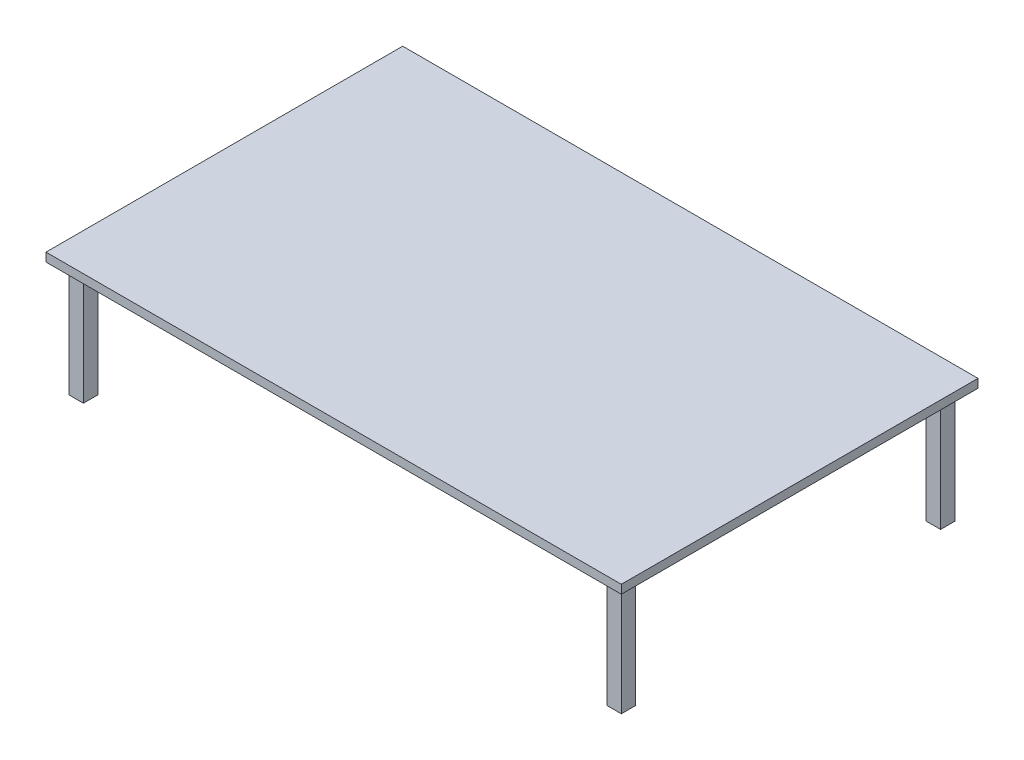
ISO-10303-21;
HEADER;
FILE_DESCRIPTION(('STEP AP214'),'2;1');
FILE_NAME('part.step','',(''),(''),'','','');
FILE_SCHEMA(('AUTOMOTIVE_DESIGN { 1 0 10303 214 1 1 1 1 }'));
ENDSEC;
DATA;
#1=APPLICATION_CONTEXT('core data for automotive mechanical design processes');
#2=APPLICATION_PROTOCOL_DEFINITION('international standard','automotive_design',2000,#1);
#3=PRODUCT_CONTEXT('',#1,'mechanical');
#4=PRODUCT('Part','Part','',(#3));
#5=PRODUCT_RELATED_PRODUCT_CATEGORY('part','',(#4));
#6=PRODUCT_DEFINITION_FORMATION('','',#4);
#7=PRODUCT_DEFINITION_CONTEXT('part definition',#1,'design');
#8=PRODUCT_DEFINITION('design','',#6,#7);
#9=PRODUCT_DEFINITION_SHAPE('','',#8);
#10=(LENGTH_UNIT() NAMED_UNIT(*) SI_UNIT(.MILLI.,.METRE.));
#11=(NAMED_UNIT(*) PLANE_ANGLE_UNIT() SI_UNIT($,.RADIAN.));
#12=(NAMED_UNIT(*) SI_UNIT($,.STERADIAN.) SOLID_ANGLE_UNIT());
#13=UNCERTAINTY_MEASURE_WITH_UNIT(LENGTH_MEASURE(1.E-05),#10,'distance_accuracy_value','');
#14=(GEOMETRIC_REPRESENTATION_CONTEXT(3) GLOBAL_UNCERTAINTY_ASSIGNED_CONTEXT((#13)) GLOBAL_UNIT_ASSIGNED_CONTEXT((#10,
#11,#12)) REPRESENTATION_CONTEXT('',''));
#15=CARTESIAN_POINT('',(0.,0.,0.));
#16=DIRECTION('',(0.,0.,1.));
#17=DIRECTION('',(1.,0.,0.));
#18=AXIS2_PLACEMENT_3D('',#15,#16,#17);
#19=CARTESIAN_POINT('',(0.,200.,0.));
#20=DIRECTION('',(0.,1.,0.));
#21=DIRECTION('',(0.,0.,1.));
#22=AXIS2_PLACEMENT_3D('',#19,#20,#21);
#23=PLANE('',#22);
#24=DIRECTION('',(0.,0.,-1.));
#25=VECTOR('',#24,1.);
#26=CARTESIAN_POINT('',(480.,200.,-290.));
#27=LINE('',#26,#25);
#28=CARTESIAN_POINT('',(480.,200.,-265.));
#29=VERTEX_POINT('',#28);
#30=CARTESIAN_POINT('',(480.,200.,-290.));
#31=VERTEX_POINT('',#30);
#32=EDGE_CURVE('E203',#29,#31,#27,.T.);
#33=ORIENTED_EDGE('',*,*,#32,.T.);
#34=DIRECTION('',(-1.,0.,0.));
#35=VECTOR('',#34,1.);
#36=CARTESIAN_POINT('',(480.,200.,-290.));
#37=LINE('',#36,#35);
#38=CARTESIAN_POINT('',(455.,200.,-290.));
#39=VERTEX_POINT('',#38);
#40=EDGE_CURVE('E205',#31,#39,#37,.T.);
#41=ORIENTED_EDGE('',*,*,#40,.T.);
#42=DIRECTION('',(0.,0.,1.));
#43=VECTOR('',#42,1.);
#44=CARTESIAN_POINT('',(455.,200.,-290.));
#45=LINE('',#44,#43);
#46=CARTESIAN_POINT('',(455.,200.,-265.));
#47=VERTEX_POINT('',#46);
#48=EDGE_CURVE('E208',#39,#47,#45,.T.);
#49=ORIENTED_EDGE('',*,*,#48,.T.);
#50=DIRECTION('',(1.,0.,0.));
#51=VECTOR('',#50,1.);
#52=CARTESIAN_POINT('',(480.,200.,-265.));
#53=LINE('',#52,#51);
#54=EDGE_CURVE('E210',#47,#29,#53,.T.);
#55=ORIENTED_EDGE('',*,*,#54,.T.);
#56=EDGE_LOOP('',(#33,#41,#49,#55));
#57=FACE_BOUND('',#56,.T.);
#58=DIRECTION('',(-1.,0.,0.));
#59=VECTOR('',#58,1.);
#60=CARTESIAN_POINT('',(-480.,200.,265.));
#61=LINE('',#60,#59);
#62=CARTESIAN_POINT('',(-455.,200.,265.));
#63=VERTEX_POINT('',#62);
#64=CARTESIAN_POINT('',(-480.,200.,265.));
#65=VERTEX_POINT('',#64);
#66=EDGE_CURVE('E301',#63,#65,#61,.T.);
#67=ORIENTED_EDGE('',*,*,#66,.T.);
#68=DIRECTION('',(0.,0.,1.));
#69=VECTOR('',#68,1.);
#70=CARTESIAN_POINT('',(-480.,200.,290.));
#71=LINE('',#70,#69);
#72=CARTESIAN_POINT('',(-480.,200.,290.));
#73=VERTEX_POINT('',#72);
#74=EDGE_CURVE('E291',#65,#73,#71,.T.);
#75=ORIENTED_EDGE('',*,*,#74,.T.);
#76=DIRECTION('',(1.,0.,0.));
#77=VECTOR('',#76,1.);
#78=CARTESIAN_POINT('',(-480.,200.,290.));
#79=LINE('',#78,#77);
#80=CARTESIAN_POINT('',(-455.,200.,290.));
#81=VERTEX_POINT('',#80);
#82=EDGE_CURVE('E294',#73,#81,#79,.T.);
#83=ORIENTED_EDGE('',*,*,#82,.T.);
#84=DIRECTION('',(0.,0.,-1.));
#85=VECTOR('',#84,1.);
#86=CARTESIAN_POINT('',(-455.,200.,290.));
#87=LINE('',#86,#85);
#88=EDGE_CURVE('E298',#81,#63,#87,.T.);
#89=ORIENTED_EDGE('',*,*,#88,.T.);
#90=EDGE_LOOP('',(#67,#75,#83,#89));
#91=FACE_BOUND('',#90,.T.);
#92=DIRECTION('',(-1.,0.,0.));
#93=VECTOR('',#92,1.);
#94=CARTESIAN_POINT('',(500.,200.,-310.));
#95=LINE('',#94,#93);
#96=CARTESIAN_POINT('',(500.,200.,-310.));
#97=VERTEX_POINT('',#96);
#98=CARTESIAN_POINT('',(-500.,200.,-310.));
#99=VERTEX_POINT('',#98);
#100=EDGE_CURVE('E260',#97,#99,#95,.T.);
#101=ORIENTED_EDGE('',*,*,#100,.F.);
#102=DIRECTION('',(0.,0.,-1.));
#103=VECTOR('',#102,1.);
#104=CARTESIAN_POINT('',(500.,200.,-310.));
#105=LINE('',#104,#103);
#106=CARTESIAN_POINT('',(500.,200.,310.));
#107=VERTEX_POINT('',#106);
#108=EDGE_CURVE('E265',#107,#97,#105,.T.);
#109=ORIENTED_EDGE('',*,*,#108,.F.);
#110=DIRECTION('',(1.,0.,0.));
#111=VECTOR('',#110,1.);
#112=CARTESIAN_POINT('',(500.,200.,310.));
#113=LINE('',#112,#111);
#114=CARTESIAN_POINT('',(-500.,200.,310.));
#115=VERTEX_POINT('',#114);
#116=EDGE_CURVE('E276',#115,#107,#113,.T.);
#117=ORIENTED_EDGE('',*,*,#116,.F.);
#118=DIRECTION('',(0.,0.,1.));
#119=VECTOR('',#118,1.);
#120=CARTESIAN_POINT('',(-500.,200.,-310.));
#121=LINE('',#120,#119);
#122=EDGE_CURVE('E274',#99,#115,#121,.T.);
#123=ORIENTED_EDGE('',*,*,#122,.F.);
#124=EDGE_LOOP('',(#101,#109,#117,#123));
#125=FACE_BOUND('',#124,.T.);
#126=DIRECTION('',(-1.,0.,0.));
#127=VECTOR('',#126,1.);
#128=CARTESIAN_POINT('',(-480.,200.,-290.));
#129=LINE('',#128,#127);
#130=CARTESIAN_POINT('',(-455.,200.,-290.));
#131=VERTEX_POINT('',#130);
#132=CARTESIAN_POINT('',(-480.,200.,-290.));
#133=VERTEX_POINT('',#132);
#134=EDGE_CURVE('E232',#131,#133,#129,.T.);
#135=ORIENTED_EDGE('',*,*,#134,.T.);
#136=DIRECTION('',(0.,0.,1.));
#137=VECTOR('',#136,1.);
#138=CARTESIAN_POINT('',(-480.,200.,-290.));
#139=LINE('',#138,#137);
#140=CARTESIAN_POINT('',(-480.,200.,-265.));
#141=VERTEX_POINT('',#140);
#142=EDGE_CURVE('E234',#133,#141,#139,.T.);
#143=ORIENTED_EDGE('',*,*,#142,.T.);
#144=DIRECTION('',(1.,0.,0.));
#145=VECTOR('',#144,1.);
#146=CARTESIAN_POINT('',(-480.,200.,-265.));
#147=LINE('',#146,#145);
#148=CARTESIAN_POINT('',(-455.,200.,-265.));
#149=VERTEX_POINT('',#148);
#150=EDGE_CURVE('E237',#141,#149,#147,.T.);
#151=ORIENTED_EDGE('',*,*,#150,.T.);
#152=DIRECTION('',(0.,0.,-1.));
#153=VECTOR('',#152,1.);
#154=CARTESIAN_POINT('',(-455.,200.,-290.));
#155=LINE('',#154,#153);
#156=EDGE_CURVE('E239',#149,#131,#155,.T.);
#157=ORIENTED_EDGE('',*,*,#156,.T.);
#158=EDGE_LOOP('',(#135,#143,#151,#157));
#159=FACE_BOUND('',#158,.T.);
#160=DIRECTION('',(1.,0.,0.));
#161=VECTOR('',#160,1.);
#162=CARTESIAN_POINT('',(480.,200.,290.));
#163=LINE('',#162,#161);
#164=CARTESIAN_POINT('',(455.,200.,290.));
#165=VERTEX_POINT('',#164);
#166=CARTESIAN_POINT('',(480.,200.,290.));
#167=VERTEX_POINT('',#166);
#168=EDGE_CURVE('E48',#165,#167,#163,.T.);
#169=ORIENTED_EDGE('',*,*,#168,.T.);
#170=DIRECTION('',(0.,0.,-1.));
#171=VECTOR('',#170,1.);
#172=CARTESIAN_POINT('',(480.,200.,290.));
#173=LINE('',#172,#171);
#174=CARTESIAN_POINT('',(480.,200.,265.));
#175=VERTEX_POINT('',#174);
#176=EDGE_CURVE('E52',#167,#175,#173,.T.);
#177=ORIENTED_EDGE('',*,*,#176,.T.);
#178=DIRECTION('',(-1.,0.,0.));
#179=VECTOR('',#178,1.);
#180=CARTESIAN_POINT('',(480.,200.,265.));
#181=LINE('',#180,#179);
#182=CARTESIAN_POINT('',(455.,200.,265.));
#183=VERTEX_POINT('',#182);
#184=EDGE_CURVE('E166',#175,#183,#181,.T.);
#185=ORIENTED_EDGE('',*,*,#184,.T.);
#186=DIRECTION('',(0.,0.,1.));
#187=VECTOR('',#186,1.);
#188=CARTESIAN_POINT('',(455.,200.,290.));
#189=LINE('',#188,#187);
#190=EDGE_CURVE('E169',#183,#165,#189,.T.);
#191=ORIENTED_EDGE('',*,*,#190,.T.);
#192=EDGE_LOOP('',(#169,#177,#185,#191));
#193=FACE_BOUND('',#192,.T.);
#194=ADVANCED_FACE('F33',(#57,#91,#125,#159,#193),#23,.F.);
#195=CARTESIAN_POINT('',(-480.,200.,290.));
#196=DIRECTION('',(1.,0.,0.));
#197=DIRECTION('',(0.,0.,-1.));
#198=AXIS2_PLACEMENT_3D('',#195,#196,#197);
#199=PLANE('',#198);
#200=DIRECTION('',(0.,0.,1.));
#201=VECTOR('',#200,1.);
#202=CARTESIAN_POINT('',(-480.,0.,290.));
#203=LINE('',#202,#201);
#204=CARTESIAN_POINT('',(-480.,0.,265.));
#205=VERTEX_POINT('',#204);
#206=CARTESIAN_POINT('',(-480.,0.,290.));
#207=VERTEX_POINT('',#206);
#208=EDGE_CURVE('E290',#205,#207,#203,.T.);
#209=ORIENTED_EDGE('',*,*,#208,.T.);
#210=DIRECTION('',(0.,-1.,0.));
#211=VECTOR('',#210,1.);
#212=CARTESIAN_POINT('',(-480.,200.,290.));
#213=LINE('',#212,#211);
#214=EDGE_CURVE('E11',#73,#207,#213,.T.);
#215=ORIENTED_EDGE('',*,*,#214,.F.);
#216=ORIENTED_EDGE('',*,*,#74,.F.);
#217=DIRECTION('',(0.,-1.,0.));
#218=VECTOR('',#217,1.);
#219=CARTESIAN_POINT('',(-480.,200.,265.));
#220=LINE('',#219,#218);
#221=EDGE_CURVE('E304',#65,#205,#220,.T.);
#222=ORIENTED_EDGE('',*,*,#221,.T.);
#223=EDGE_LOOP('',(#209,#215,#216,#222));
#224=FACE_BOUND('',#223,.T.);
#225=ADVANCED_FACE('F35',(#224),#199,.F.);
#226=CARTESIAN_POINT('',(-480.,200.,290.));
#227=DIRECTION('',(0.,0.,-1.));
#228=DIRECTION('',(-1.,0.,0.));
#229=AXIS2_PLACEMENT_3D('',#226,#227,#228);
#230=PLANE('',#229);
#231=DIRECTION('',(1.,0.,0.));
#232=VECTOR('',#231,1.);
#233=CARTESIAN_POINT('',(-480.,0.,290.));
#234=LINE('',#233,#232);
#235=CARTESIAN_POINT('',(-455.,0.,290.));
#236=VERTEX_POINT('',#235);
#237=EDGE_CURVE('E307',#207,#236,#234,.T.);
#238=ORIENTED_EDGE('',*,*,#237,.T.);
#239=DIRECTION('',(0.,-1.,0.));
#240=VECTOR('',#239,1.);
#241=CARTESIAN_POINT('',(-455.,200.,290.));
#242=LINE('',#241,#240);
#243=EDGE_CURVE('E41',#81,#236,#242,.T.);
#244=ORIENTED_EDGE('',*,*,#243,.F.);
#245=ORIENTED_EDGE('',*,*,#82,.F.);
#246=ORIENTED_EDGE('',*,*,#214,.T.);
#247=EDGE_LOOP('',(#238,#244,#245,#246));
#248=FACE_BOUND('',#247,.T.);
#249=ADVANCED_FACE('F334',(#248),#230,.F.);
#250=CARTESIAN_POINT('',(-455.,200.,290.));
#251=DIRECTION('',(-1.,0.,0.));
#252=DIRECTION('',(0.,0.,1.));
#253=AXIS2_PLACEMENT_3D('',#250,#251,#252);
#254=PLANE('',#253);
#255=DIRECTION('',(0.,0.,-1.));
#256=VECTOR('',#255,1.);
#257=CARTESIAN_POINT('',(-455.,0.,290.));
#258=LINE('',#257,#256);
#259=CARTESIAN_POINT('',(-455.,0.,265.));
#260=VERTEX_POINT('',#259);
#261=EDGE_CURVE('E309',#236,#260,#258,.T.);
#262=ORIENTED_EDGE('',*,*,#261,.T.);
#263=DIRECTION('',(0.,-1.,0.));
#264=VECTOR('',#263,1.);
#265=CARTESIAN_POINT('',(-455.,200.,265.));
#266=LINE('',#265,#264);
#267=EDGE_CURVE('E314',#63,#260,#266,.T.);
#268=ORIENTED_EDGE('',*,*,#267,.F.);
#269=ORIENTED_EDGE('',*,*,#88,.F.);
#270=ORIENTED_EDGE('',*,*,#243,.T.);
#271=EDGE_LOOP('',(#262,#268,#269,#270));
#272=FACE_BOUND('',#271,.T.);
#273=ADVANCED_FACE('F320',(#272),#254,.F.);
#274=CARTESIAN_POINT('',(-480.,200.,265.));
#275=DIRECTION('',(0.,0.,1.));
#276=DIRECTION('',(1.,0.,0.));
#277=AXIS2_PLACEMENT_3D('',#274,#275,#276);
#278=PLANE('',#277);
#279=DIRECTION('',(-1.,0.,0.));
#280=VECTOR('',#279,1.);
#281=CARTESIAN_POINT('',(-480.,0.,265.));
#282=LINE('',#281,#280);
#283=EDGE_CURVE('E295',#260,#205,#282,.T.);
#284=ORIENTED_EDGE('',*,*,#283,.T.);
#285=ORIENTED_EDGE('',*,*,#221,.F.);
#286=ORIENTED_EDGE('',*,*,#66,.F.);
#287=ORIENTED_EDGE('',*,*,#267,.T.);
#288=EDGE_LOOP('',(#284,#285,#286,#287));
#289=FACE_BOUND('',#288,.T.);
#290=ADVANCED_FACE('F328',(#289),#278,.F.);
#291=CARTESIAN_POINT('',(0.,0.,0.));
#292=DIRECTION('',(0.,-1.,0.));
#293=DIRECTION('',(0.,0.,-1.));
#294=AXIS2_PLACEMENT_3D('',#291,#292,#293);
#295=PLANE('',#294);
#296=ORIENTED_EDGE('',*,*,#208,.F.);
#297=ORIENTED_EDGE('',*,*,#283,.F.);
#298=ORIENTED_EDGE('',*,*,#261,.F.);
#299=ORIENTED_EDGE('',*,*,#237,.F.);
#300=EDGE_LOOP('',(#296,#297,#298,#299));
#301=FACE_BOUND('',#300,.T.);
#302=ADVANCED_FACE('F325',(#301),#295,.T.);
#303=CARTESIAN_POINT('',(500.,215.,-310.));
#304=DIRECTION('',(0.,0.,1.));
#305=DIRECTION('',(1.,0.,0.));
#306=AXIS2_PLACEMENT_3D('',#303,#304,#305);
#307=PLANE('',#306);
#308=ORIENTED_EDGE('',*,*,#100,.T.);
#309=DIRECTION('',(0.,-1.,0.));
#310=VECTOR('',#309,1.);
#311=CARTESIAN_POINT('',(-500.,215.,-310.));
#312=LINE('',#311,#310);
#313=CARTESIAN_POINT('',(-500.,215.,-310.));
#314=VERTEX_POINT('',#313);
#315=EDGE_CURVE('E287',#314,#99,#312,.T.);
#316=ORIENTED_EDGE('',*,*,#315,.F.);
#317=DIRECTION('',(-1.,0.,0.));
#318=VECTOR('',#317,1.);
#319=CARTESIAN_POINT('',(500.,215.,-310.));
#320=LINE('',#319,#318);
#321=CARTESIAN_POINT('',(500.,215.,-310.));
#322=VERTEX_POINT('',#321);
#323=EDGE_CURVE('E261',#322,#314,#320,.T.);
#324=ORIENTED_EDGE('',*,*,#323,.F.);
#325=DIRECTION('',(0.,-1.,0.));
#326=VECTOR('',#325,1.);
#327=CARTESIAN_POINT('',(500.,215.,-310.));
#328=LINE('',#327,#326);
#329=EDGE_CURVE('E271',#322,#97,#328,.T.);
#330=ORIENTED_EDGE('',*,*,#329,.T.);
#331=EDGE_LOOP('',(#308,#316,#324,#330));
#332=FACE_BOUND('',#331,.T.);
#333=ADVANCED_FACE('F361',(#332),#307,.F.);
#334=CARTESIAN_POINT('',(-500.,215.,-310.));
#335=DIRECTION('',(1.,0.,0.));
#336=DIRECTION('',(0.,0.,-1.));
#337=AXIS2_PLACEMENT_3D('',#334,#335,#336);
#338=PLANE('',#337);
#339=ORIENTED_EDGE('',*,*,#122,.T.);
#340=DIRECTION('',(0.,-1.,0.));
#341=VECTOR('',#340,1.);
#342=CARTESIAN_POINT('',(-500.,215.,310.));
#343=LINE('',#342,#341);
#344=CARTESIAN_POINT('',(-500.,215.,310.));
#345=VERTEX_POINT('',#344);
#346=EDGE_CURVE('E284',#345,#115,#343,.T.);
#347=ORIENTED_EDGE('',*,*,#346,.F.);
#348=DIRECTION('',(0.,0.,1.));
#349=VECTOR('',#348,1.);
#350=CARTESIAN_POINT('',(-500.,215.,-310.));
#351=LINE('',#350,#349);
#352=EDGE_CURVE('E264',#314,#345,#351,.T.);
#353=ORIENTED_EDGE('',*,*,#352,.F.);
#354=ORIENTED_EDGE('',*,*,#315,.T.);
#355=EDGE_LOOP('',(#339,#347,#353,#354));
#356=FACE_BOUND('',#355,.T.);
#357=ADVANCED_FACE('F357',(#356),#338,.F.);
#358=CARTESIAN_POINT('',(500.,215.,310.));
#359=DIRECTION('',(0.,0.,-1.));
#360=DIRECTION('',(-1.,0.,0.));
#361=AXIS2_PLACEMENT_3D('',#358,#359,#360);
#362=PLANE('',#361);
#363=ORIENTED_EDGE('',*,*,#116,.T.);
#364=DIRECTION('',(0.,-1.,0.));
#365=VECTOR('',#364,1.);
#366=CARTESIAN_POINT('',(500.,215.,310.));
#367=LINE('',#366,#365);
#368=CARTESIAN_POINT('',(500.,215.,310.));
#369=VERTEX_POINT('',#368);
#370=EDGE_CURVE('E281',#369,#107,#367,.T.);
#371=ORIENTED_EDGE('',*,*,#370,.F.);
#372=DIRECTION('',(1.,0.,0.));
#373=VECTOR('',#372,1.);
#374=CARTESIAN_POINT('',(500.,215.,310.));
#375=LINE('',#374,#373);
#376=EDGE_CURVE('E267',#345,#369,#375,.T.);
#377=ORIENTED_EDGE('',*,*,#376,.F.);
#378=ORIENTED_EDGE('',*,*,#346,.T.);
#379=EDGE_LOOP('',(#363,#371,#377,#378));
#380=FACE_BOUND('',#379,.T.);
#381=ADVANCED_FACE('F353',(#380),#362,.F.);
#382=CARTESIAN_POINT('',(500.,215.,-310.));
#383=DIRECTION('',(-1.,0.,0.));
#384=DIRECTION('',(0.,0.,1.));
#385=AXIS2_PLACEMENT_3D('',#382,#383,#384);
#386=PLANE('',#385);
#387=ORIENTED_EDGE('',*,*,#108,.T.);
#388=ORIENTED_EDGE('',*,*,#329,.F.);
#389=DIRECTION('',(0.,0.,-1.));
#390=VECTOR('',#389,1.);
#391=CARTESIAN_POINT('',(500.,215.,-310.));
#392=LINE('',#391,#390);
#393=EDGE_CURVE('E269',#369,#322,#392,.T.);
#394=ORIENTED_EDGE('',*,*,#393,.F.);
#395=ORIENTED_EDGE('',*,*,#370,.T.);
#396=EDGE_LOOP('',(#387,#388,#394,#395));
#397=FACE_BOUND('',#396,.T.);
#398=ADVANCED_FACE('F350',(#397),#386,.F.);
#399=CARTESIAN_POINT('',(0.,215.,0.));
#400=DIRECTION('',(0.,1.,0.));
#401=DIRECTION('',(0.,0.,1.));
#402=AXIS2_PLACEMENT_3D('',#399,#400,#401);
#403=PLANE('',#402);
#404=ORIENTED_EDGE('',*,*,#323,.T.);
#405=ORIENTED_EDGE('',*,*,#352,.T.);
#406=ORIENTED_EDGE('',*,*,#376,.T.);
#407=ORIENTED_EDGE('',*,*,#393,.T.);
#408=EDGE_LOOP('',(#404,#405,#406,#407));
#409=FACE_BOUND('',#408,.T.);
#410=ADVANCED_FACE('F348',(#409),#403,.T.);
#411=CARTESIAN_POINT('',(-480.,200.,-290.));
#412=DIRECTION('',(0.,0.,1.));
#413=DIRECTION('',(1.,0.,0.));
#414=AXIS2_PLACEMENT_3D('',#411,#412,#413);
#415=PLANE('',#414);
#416=DIRECTION('',(-1.,0.,0.));
#417=VECTOR('',#416,1.);
#418=CARTESIAN_POINT('',(-480.,0.,-290.));
#419=LINE('',#418,#417);
#420=CARTESIAN_POINT('',(-455.,0.,-290.));
#421=VERTEX_POINT('',#420);
#422=CARTESIAN_POINT('',(-480.,0.,-290.));
#423=VERTEX_POINT('',#422);
#424=EDGE_CURVE('E231',#421,#423,#419,.T.);
#425=ORIENTED_EDGE('',*,*,#424,.T.);
#426=DIRECTION('',(0.,-1.,0.));
#427=VECTOR('',#426,1.);
#428=CARTESIAN_POINT('',(-480.,200.,-290.));
#429=LINE('',#428,#427);
#430=EDGE_CURVE('E257',#133,#423,#429,.T.);
#431=ORIENTED_EDGE('',*,*,#430,.F.);
#432=ORIENTED_EDGE('',*,*,#134,.F.);
#433=DIRECTION('',(0.,-1.,0.));
#434=VECTOR('',#433,1.);
#435=CARTESIAN_POINT('',(-455.,200.,-290.));
#436=LINE('',#435,#434);
#437=EDGE_CURVE('E241',#131,#421,#436,.T.);
#438=ORIENTED_EDGE('',*,*,#437,.T.);
#439=EDGE_LOOP('',(#425,#431,#432,#438));
#440=FACE_BOUND('',#439,.T.);
#441=ADVANCED_FACE('F399',(#440),#415,.F.);
#442=CARTESIAN_POINT('',(-480.,200.,-290.));
#443=DIRECTION('',(1.,0.,0.));
#444=DIRECTION('',(0.,0.,-1.));
#445=AXIS2_PLACEMENT_3D('',#442,#443,#444);
#446=PLANE('',#445);
#447=DIRECTION('',(0.,0.,1.));
#448=VECTOR('',#447,1.);
#449=CARTESIAN_POINT('',(-480.,0.,-290.));
#450=LINE('',#449,#448);
#451=CARTESIAN_POINT('',(-480.,0.,-265.));
#452=VERTEX_POINT('',#451);
#453=EDGE_CURVE('E244',#423,#452,#450,.T.);
#454=ORIENTED_EDGE('',*,*,#453,.T.);
#455=DIRECTION('',(0.,-1.,0.));
#456=VECTOR('',#455,1.);
#457=CARTESIAN_POINT('',(-480.,200.,-265.));
#458=LINE('',#457,#456);
#459=EDGE_CURVE('E254',#141,#452,#458,.T.);
#460=ORIENTED_EDGE('',*,*,#459,.F.);
#461=ORIENTED_EDGE('',*,*,#142,.F.);
#462=ORIENTED_EDGE('',*,*,#430,.T.);
#463=EDGE_LOOP('',(#454,#460,#461,#462));
#464=FACE_BOUND('',#463,.T.);
#465=ADVANCED_FACE('F406',(#464),#446,.F.);
#466=CARTESIAN_POINT('',(-480.,200.,-265.));
#467=DIRECTION('',(0.,0.,-1.));
#468=DIRECTION('',(-1.,0.,0.));
#469=AXIS2_PLACEMENT_3D('',#466,#467,#468);
#470=PLANE('',#469);
#471=DIRECTION('',(1.,0.,0.));
#472=VECTOR('',#471,1.);
#473=CARTESIAN_POINT('',(-480.,0.,-265.));
#474=LINE('',#473,#472);
#475=CARTESIAN_POINT('',(-455.,0.,-265.));
#476=VERTEX_POINT('',#475);
#477=EDGE_CURVE('E246',#452,#476,#474,.T.);
#478=ORIENTED_EDGE('',*,*,#477,.T.);
#479=DIRECTION('',(0.,-1.,0.));
#480=VECTOR('',#479,1.);
#481=CARTESIAN_POINT('',(-455.,200.,-265.));
#482=LINE('',#481,#480);
#483=EDGE_CURVE('E251',#149,#476,#482,.T.);
#484=ORIENTED_EDGE('',*,*,#483,.F.);
#485=ORIENTED_EDGE('',*,*,#150,.F.);
#486=ORIENTED_EDGE('',*,*,#459,.T.);
#487=EDGE_LOOP('',(#478,#484,#485,#486));
#488=FACE_BOUND('',#487,.T.);
#489=ADVANCED_FACE('F413',(#488),#470,.F.);
#490=CARTESIAN_POINT('',(-455.,200.,-290.));
#491=DIRECTION('',(-1.,0.,0.));
#492=DIRECTION('',(0.,0.,1.));
#493=AXIS2_PLACEMENT_3D('',#490,#491,#492);
#494=PLANE('',#493);
#495=DIRECTION('',(0.,0.,-1.));
#496=VECTOR('',#495,1.);
#497=CARTESIAN_POINT('',(-455.,0.,-290.));
#498=LINE('',#497,#496);
#499=EDGE_CURVE('E235',#476,#421,#498,.T.);
#500=ORIENTED_EDGE('',*,*,#499,.T.);
#501=ORIENTED_EDGE('',*,*,#437,.F.);
#502=ORIENTED_EDGE('',*,*,#156,.F.);
#503=ORIENTED_EDGE('',*,*,#483,.T.);
#504=EDGE_LOOP('',(#500,#501,#502,#503));
#505=FACE_BOUND('',#504,.T.);
#506=ADVANCED_FACE('F421',(#505),#494,.F.);
#507=CARTESIAN_POINT('',(0.,0.,0.));
#508=DIRECTION('',(0.,-1.,0.));
#509=DIRECTION('',(0.,0.,-1.));
#510=AXIS2_PLACEMENT_3D('',#507,#508,#509);
#511=PLANE('',#510);
#512=ORIENTED_EDGE('',*,*,#424,.F.);
#513=ORIENTED_EDGE('',*,*,#499,.F.);
#514=ORIENTED_EDGE('',*,*,#477,.F.);
#515=ORIENTED_EDGE('',*,*,#453,.F.);
#516=EDGE_LOOP('',(#512,#513,#514,#515));
#517=FACE_BOUND('',#516,.T.);
#518=ADVANCED_FACE('F429',(#517),#511,.T.);
#519=CARTESIAN_POINT('',(480.,200.,-290.));
#520=DIRECTION('',(-1.,0.,0.));
#521=DIRECTION('',(0.,0.,1.));
#522=AXIS2_PLACEMENT_3D('',#519,#520,#521);
#523=PLANE('',#522);
#524=DIRECTION('',(0.,0.,-1.));
#525=VECTOR('',#524,1.);
#526=CARTESIAN_POINT('',(480.,0.,-290.));
#527=LINE('',#526,#525);
#528=CARTESIAN_POINT('',(480.,0.,-265.));
#529=VERTEX_POINT('',#528);
#530=CARTESIAN_POINT('',(480.,0.,-290.));
#531=VERTEX_POINT('',#530);
#532=EDGE_CURVE('E202',#529,#531,#527,.T.);
#533=ORIENTED_EDGE('',*,*,#532,.T.);
#534=DIRECTION('',(0.,-1.,0.));
#535=VECTOR('',#534,1.);
#536=CARTESIAN_POINT('',(480.,200.,-290.));
#537=LINE('',#536,#535);
#538=EDGE_CURVE('E228',#31,#531,#537,.T.);
#539=ORIENTED_EDGE('',*,*,#538,.F.);
#540=ORIENTED_EDGE('',*,*,#32,.F.);
#541=DIRECTION('',(0.,-1.,0.));
#542=VECTOR('',#541,1.);
#543=CARTESIAN_POINT('',(480.,200.,-265.));
#544=LINE('',#543,#542);
#545=EDGE_CURVE('E212',#29,#529,#544,.T.);
#546=ORIENTED_EDGE('',*,*,#545,.T.);
#547=EDGE_LOOP('',(#533,#539,#540,#546));
#548=FACE_BOUND('',#547,.T.);
#549=ADVANCED_FACE('F437',(#548),#523,.F.);
#550=CARTESIAN_POINT('',(480.,200.,-290.));
#551=DIRECTION('',(0.,0.,1.));
#552=DIRECTION('',(1.,0.,0.));
#553=AXIS2_PLACEMENT_3D('',#550,#551,#552);
#554=PLANE('',#553);
#555=DIRECTION('',(-1.,0.,0.));
#556=VECTOR('',#555,1.);
#557=CARTESIAN_POINT('',(480.,0.,-290.));
#558=LINE('',#557,#556);
#559=CARTESIAN_POINT('',(455.,0.,-290.));
#560=VERTEX_POINT('',#559);
#561=EDGE_CURVE('E215',#531,#560,#558,.T.);
#562=ORIENTED_EDGE('',*,*,#561,.T.);
#563=DIRECTION('',(0.,-1.,0.));
#564=VECTOR('',#563,1.);
#565=CARTESIAN_POINT('',(455.,200.,-290.));
#566=LINE('',#565,#564);
#567=EDGE_CURVE('E225',#39,#560,#566,.T.);
#568=ORIENTED_EDGE('',*,*,#567,.F.);
#569=ORIENTED_EDGE('',*,*,#40,.F.);
#570=ORIENTED_EDGE('',*,*,#538,.T.);
#571=EDGE_LOOP('',(#562,#568,#569,#570));
#572=FACE_BOUND('',#571,.T.);
#573=ADVANCED_FACE('F445',(#572),#554,.F.);
#574=CARTESIAN_POINT('',(455.,200.,-290.));
#575=DIRECTION('',(1.,0.,0.));
#576=DIRECTION('',(0.,0.,-1.));
#577=AXIS2_PLACEMENT_3D('',#574,#575,#576);
#578=PLANE('',#577);
#579=DIRECTION('',(0.,0.,1.));
#580=VECTOR('',#579,1.);
#581=CARTESIAN_POINT('',(455.,0.,-290.));
#582=LINE('',#581,#580);
#583=CARTESIAN_POINT('',(455.,0.,-265.));
#584=VERTEX_POINT('',#583);
#585=EDGE_CURVE('E217',#560,#584,#582,.T.);
#586=ORIENTED_EDGE('',*,*,#585,.T.);
#587=DIRECTION('',(0.,-1.,0.));
#588=VECTOR('',#587,1.);
#589=CARTESIAN_POINT('',(455.,200.,-265.));
#590=LINE('',#589,#588);
#591=EDGE_CURVE('E222',#47,#584,#590,.T.);
#592=ORIENTED_EDGE('',*,*,#591,.F.);
#593=ORIENTED_EDGE('',*,*,#48,.F.);
#594=ORIENTED_EDGE('',*,*,#567,.T.);
#595=EDGE_LOOP('',(#586,#592,#593,#594));
#596=FACE_BOUND('',#595,.T.);
#597=ADVANCED_FACE('F453',(#596),#578,.F.);
#598=CARTESIAN_POINT('',(480.,200.,-265.));
#599=DIRECTION('',(0.,0.,-1.));
#600=DIRECTION('',(-1.,0.,0.));
#601=AXIS2_PLACEMENT_3D('',#598,#599,#600);
#602=PLANE('',#601);
#603=DIRECTION('',(1.,0.,0.));
#604=VECTOR('',#603,1.);
#605=CARTESIAN_POINT('',(480.,0.,-265.));
#606=LINE('',#605,#604);
#607=EDGE_CURVE('E206',#584,#529,#606,.T.);
#608=ORIENTED_EDGE('',*,*,#607,.T.);
#609=ORIENTED_EDGE('',*,*,#545,.F.);
#610=ORIENTED_EDGE('',*,*,#54,.F.);
#611=ORIENTED_EDGE('',*,*,#591,.T.);
#612=EDGE_LOOP('',(#608,#609,#610,#611));
#613=FACE_BOUND('',#612,.T.);
#614=ADVANCED_FACE('F461',(#613),#602,.F.);
#615=CARTESIAN_POINT('',(0.,0.,0.));
#616=DIRECTION('',(0.,-1.,0.));
#617=DIRECTION('',(0.,0.,-1.));
#618=AXIS2_PLACEMENT_3D('',#615,#616,#617);
#619=PLANE('',#618);
#620=ORIENTED_EDGE('',*,*,#532,.F.);
#621=ORIENTED_EDGE('',*,*,#607,.F.);
#622=ORIENTED_EDGE('',*,*,#585,.F.);
#623=ORIENTED_EDGE('',*,*,#561,.F.);
#624=EDGE_LOOP('',(#620,#621,#622,#623));
#625=FACE_BOUND('',#624,.T.);
#626=ADVANCED_FACE('F469',(#625),#619,.T.);
#627=CARTESIAN_POINT('',(480.,200.,290.));
#628=DIRECTION('',(0.,0.,-1.));
#629=DIRECTION('',(-1.,0.,0.));
#630=AXIS2_PLACEMENT_3D('',#627,#628,#629);
#631=PLANE('',#630);
#632=DIRECTION('',(1.,0.,0.));
#633=VECTOR('',#632,1.);
#634=CARTESIAN_POINT('',(480.,0.,290.));
#635=LINE('',#634,#633);
#636=CARTESIAN_POINT('',(455.,0.,290.));
#637=VERTEX_POINT('',#636);
#638=CARTESIAN_POINT('',(480.,0.,290.));
#639=VERTEX_POINT('',#638);
#640=EDGE_CURVE('E190',#637,#639,#635,.T.);
#641=ORIENTED_EDGE('',*,*,#640,.T.);
#642=DIRECTION('',(0.,-1.,0.));
#643=VECTOR('',#642,1.);
#644=CARTESIAN_POINT('',(480.,200.,290.));
#645=LINE('',#644,#643);
#646=EDGE_CURVE('E199',#167,#639,#645,.T.);
#647=ORIENTED_EDGE('',*,*,#646,.F.);
#648=ORIENTED_EDGE('',*,*,#168,.F.);
#649=DIRECTION('',(0.,-1.,0.));
#650=VECTOR('',#649,1.);
#651=CARTESIAN_POINT('',(455.,200.,290.));
#652=LINE('',#651,#650);
#653=EDGE_CURVE('E182',#165,#637,#652,.T.);
#654=ORIENTED_EDGE('',*,*,#653,.T.);
#655=EDGE_LOOP('',(#641,#647,#648,#654));
#656=FACE_BOUND('',#655,.T.);
#657=ADVANCED_FACE('F477',(#656),#631,.F.);
#658=CARTESIAN_POINT('',(480.,200.,290.));
#659=DIRECTION('',(-1.,0.,0.));
#660=DIRECTION('',(0.,0.,1.));
#661=AXIS2_PLACEMENT_3D('',#658,#659,#660);
#662=PLANE('',#661);
#663=DIRECTION('',(0.,0.,-1.));
#664=VECTOR('',#663,1.);
#665=CARTESIAN_POINT('',(480.,0.,290.));
#666=LINE('',#665,#664);
#667=CARTESIAN_POINT('',(480.,0.,265.));
#668=VERTEX_POINT('',#667);
#669=EDGE_CURVE('E193',#639,#668,#666,.T.);
#670=ORIENTED_EDGE('',*,*,#669,.T.);
#671=DIRECTION('',(0.,-1.,0.));
#672=VECTOR('',#671,1.);
#673=CARTESIAN_POINT('',(480.,200.,265.));
#674=LINE('',#673,#672);
#675=EDGE_CURVE('E181',#175,#668,#674,.T.);
#676=ORIENTED_EDGE('',*,*,#675,.F.);
#677=ORIENTED_EDGE('',*,*,#176,.F.);
#678=ORIENTED_EDGE('',*,*,#646,.T.);
#679=EDGE_LOOP('',(#670,#676,#677,#678));
#680=FACE_BOUND('',#679,.T.);
#681=ADVANCED_FACE('F485',(#680),#662,.F.);
#682=CARTESIAN_POINT('',(480.,200.,265.));
#683=DIRECTION('',(0.,0.,1.));
#684=DIRECTION('',(1.,0.,0.));
#685=AXIS2_PLACEMENT_3D('',#682,#683,#684);
#686=PLANE('',#685);
#687=DIRECTION('',(-1.,0.,0.));
#688=VECTOR('',#687,1.);
#689=CARTESIAN_POINT('',(480.,0.,265.));
#690=LINE('',#689,#688);
#691=CARTESIAN_POINT('',(455.,0.,265.));
#692=VERTEX_POINT('',#691);
#693=EDGE_CURVE('E178',#668,#692,#690,.T.);
#694=ORIENTED_EDGE('',*,*,#693,.T.);
#695=DIRECTION('',(0.,-1.,0.));
#696=VECTOR('',#695,1.);
#697=CARTESIAN_POINT('',(455.,200.,265.));
#698=LINE('',#697,#696);
#699=EDGE_CURVE('E175',#183,#692,#698,.T.);
#700=ORIENTED_EDGE('',*,*,#699,.F.);
#701=ORIENTED_EDGE('',*,*,#184,.F.);
#702=ORIENTED_EDGE('',*,*,#675,.T.);
#703=EDGE_LOOP('',(#694,#700,#701,#702));
#704=FACE_BOUND('',#703,.T.);
#705=ADVANCED_FACE('F176',(#704),#686,.F.);
#706=CARTESIAN_POINT('',(455.,200.,290.));
#707=DIRECTION('',(1.,0.,0.));
#708=DIRECTION('',(0.,0.,-1.));
#709=AXIS2_PLACEMENT_3D('',#706,#707,#708);
#710=PLANE('',#709);
#711=DIRECTION('',(0.,0.,1.));
#712=VECTOR('',#711,1.);
#713=CARTESIAN_POINT('',(455.,0.,290.));
#714=LINE('',#713,#712);
#715=EDGE_CURVE('E196',#692,#637,#714,.T.);
#716=ORIENTED_EDGE('',*,*,#715,.T.);
#717=ORIENTED_EDGE('',*,*,#653,.F.);
#718=ORIENTED_EDGE('',*,*,#190,.F.);
#719=ORIENTED_EDGE('',*,*,#699,.T.);
#720=EDGE_LOOP('',(#716,#717,#718,#719));
#721=FACE_BOUND('',#720,.T.);
#722=ADVANCED_FACE('F184',(#721),#710,.F.);
#723=CARTESIAN_POINT('',(0.,0.,0.));
#724=DIRECTION('',(0.,-1.,0.));
#725=DIRECTION('',(0.,0.,-1.));
#726=AXIS2_PLACEMENT_3D('',#723,#724,#725);
#727=PLANE('',#726);
#728=ORIENTED_EDGE('',*,*,#640,.F.);
#729=ORIENTED_EDGE('',*,*,#715,.F.);
#730=ORIENTED_EDGE('',*,*,#693,.F.);
#731=ORIENTED_EDGE('',*,*,#669,.F.);
#732=EDGE_LOOP('',(#728,#729,#730,#731));
#733=FACE_BOUND('',#732,.T.);
#734=ADVANCED_FACE('F506',(#733),#727,.T.);
#735=CLOSED_SHELL('',(#194,#225,#249,#273,#290,#302,#333,#357,#381,#398,#410,#441,#465,#489,
#506,#518,#549,#573,#597,#614,#626,#657,#681,#705,#722,#734));
#736=MANIFOLD_SOLID_BREP('B2',#735);
#737=ADVANCED_BREP_SHAPE_REPRESENTATION('',(#18,#736),#14);
#738=SHAPE_DEFINITION_REPRESENTATION(#9,#737);
ENDSEC;
END-ISO-10303-21;
